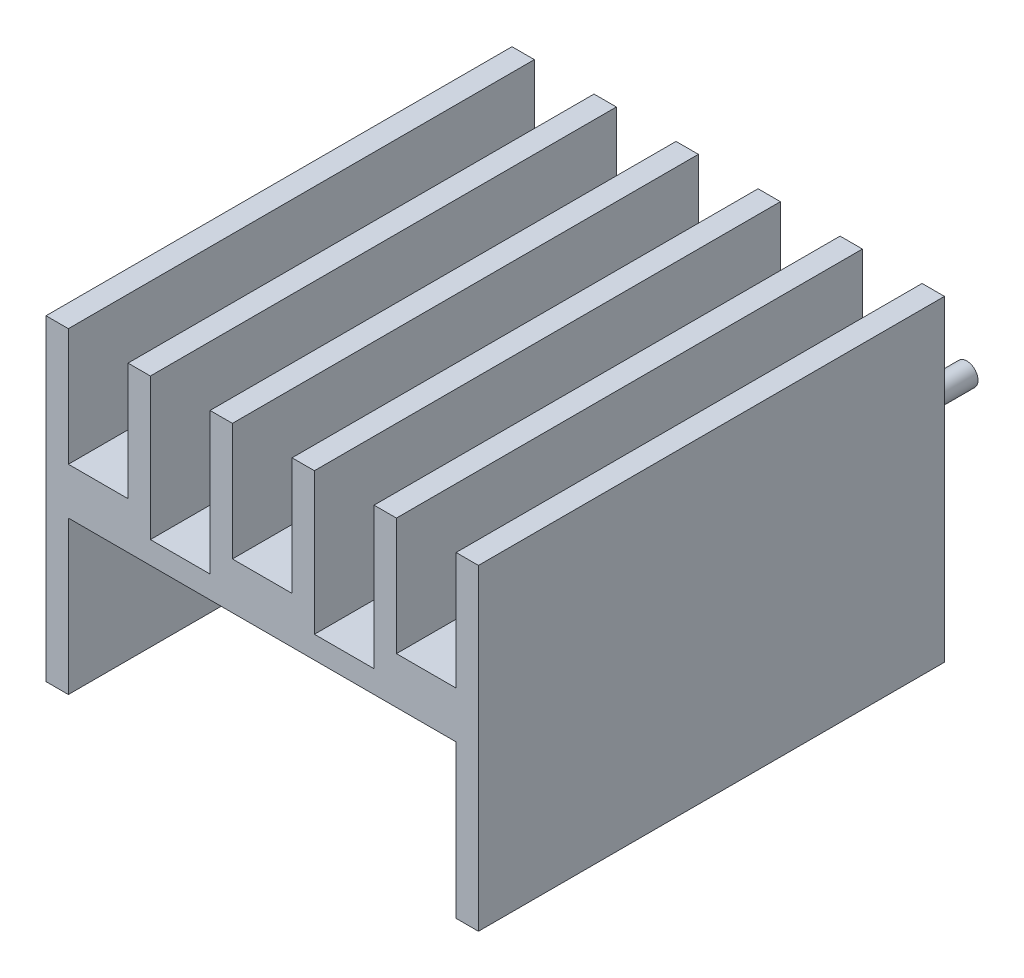
ISO-10303-21;
HEADER;
FILE_DESCRIPTION(('STEP AP214'),'2;1');
FILE_NAME('part.step','',(''),(''),'','','');
FILE_SCHEMA(('AUTOMOTIVE_DESIGN { 1 0 10303 214 1 1 1 1 }'));
ENDSEC;
DATA;
#1=APPLICATION_CONTEXT('core data for automotive mechanical design processes');
#2=APPLICATION_PROTOCOL_DEFINITION('international standard','automotive_design',2000,#1);
#3=PRODUCT_CONTEXT('',#1,'mechanical');
#4=PRODUCT('Part','Part','',(#3));
#5=PRODUCT_RELATED_PRODUCT_CATEGORY('part','',(#4));
#6=PRODUCT_DEFINITION_FORMATION('','',#4);
#7=PRODUCT_DEFINITION_CONTEXT('part definition',#1,'design');
#8=PRODUCT_DEFINITION('design','',#6,#7);
#9=PRODUCT_DEFINITION_SHAPE('','',#8);
#10=(LENGTH_UNIT() NAMED_UNIT(*) SI_UNIT(.MILLI.,.METRE.));
#11=(NAMED_UNIT(*) PLANE_ANGLE_UNIT() SI_UNIT($,.RADIAN.));
#12=(NAMED_UNIT(*) SI_UNIT($,.STERADIAN.) SOLID_ANGLE_UNIT());
#13=UNCERTAINTY_MEASURE_WITH_UNIT(LENGTH_MEASURE(1.E-05),#10,'distance_accuracy_value','');
#14=(GEOMETRIC_REPRESENTATION_CONTEXT(3) GLOBAL_UNCERTAINTY_ASSIGNED_CONTEXT((#13)) GLOBAL_UNIT_ASSIGNED_CONTEXT((#10,
#11,#12)) REPRESENTATION_CONTEXT('',''));
#15=CARTESIAN_POINT('',(0.,0.,0.));
#16=DIRECTION('',(0.,0.,1.));
#17=DIRECTION('',(1.,0.,0.));
#18=AXIS2_PLACEMENT_3D('',#15,#16,#17);
#19=CARTESIAN_POINT('',(0.,0.,0.));
#20=DIRECTION('',(0.,0.,1.));
#21=DIRECTION('',(1.,0.,0.));
#22=AXIS2_PLACEMENT_3D('',#19,#20,#21);
#23=PLANE('',#22);
#24=CARTESIAN_POINT('',(8.8,1.8,0.));
#25=DIRECTION('',(0.,0.,1.));
#26=DIRECTION('',(1.,0.,0.));
#27=AXIS2_PLACEMENT_3D('',#24,#25,#26);
#28=CIRCLE('',#27,0.6);
#29=CARTESIAN_POINT('',(9.4,1.8,0.));
#30=VERTEX_POINT('',#29);
#31=EDGE_CURVE('E44',#30,#30,#28,.F.);
#32=ORIENTED_EDGE('',*,*,#31,.F.);
#33=EDGE_LOOP('',(#32));
#34=FACE_BOUND('',#33,.T.);
#35=DIRECTION('',(-1.,0.,0.));
#36=VECTOR('',#35,1.);
#37=CARTESIAN_POINT('',(-10.4,8.8,0.));
#38=LINE('',#37,#36);
#39=CARTESIAN_POINT('',(-10.4,8.8,0.));
#40=VERTEX_POINT('',#39);
#41=CARTESIAN_POINT('',(-11.6,8.8,0.));
#42=VERTEX_POINT('',#41);
#43=EDGE_CURVE('E253',#40,#42,#38,.T.);
#44=ORIENTED_EDGE('',*,*,#43,.F.);
#45=DIRECTION('',(0.,1.,0.));
#46=VECTOR('',#45,1.);
#47=CARTESIAN_POINT('',(-10.4,2.5,0.));
#48=LINE('',#47,#46);
#49=CARTESIAN_POINT('',(-10.4,2.5,0.));
#50=VERTEX_POINT('',#49);
#51=EDGE_CURVE('E147',#50,#40,#48,.T.);
#52=ORIENTED_EDGE('',*,*,#51,.F.);
#53=DIRECTION('',(-1.,0.,0.));
#54=VECTOR('',#53,1.);
#55=CARTESIAN_POINT('',(-7.19999999999999,2.5,0.));
#56=LINE('',#55,#54);
#57=CARTESIAN_POINT('',(-7.19999999999999,2.5,0.));
#58=VERTEX_POINT('',#57);
#59=EDGE_CURVE('E141',#58,#50,#56,.T.);
#60=ORIENTED_EDGE('',*,*,#59,.F.);
#61=DIRECTION('',(0.,-1.,0.));
#62=VECTOR('',#61,1.);
#63=CARTESIAN_POINT('',(-7.2,8.8,0.));
#64=LINE('',#63,#62);
#65=CARTESIAN_POINT('',(-7.2,8.8,0.));
#66=VERTEX_POINT('',#65);
#67=EDGE_CURVE('E243',#66,#58,#64,.T.);
#68=ORIENTED_EDGE('',*,*,#67,.F.);
#69=DIRECTION('',(-1.,0.,0.));
#70=VECTOR('',#69,1.);
#71=CARTESIAN_POINT('',(-6.,8.8,0.));
#72=LINE('',#71,#70);
#73=CARTESIAN_POINT('',(-6.,8.8,0.));
#74=VERTEX_POINT('',#73);
#75=EDGE_CURVE('E303',#74,#66,#72,.T.);
#76=ORIENTED_EDGE('',*,*,#75,.F.);
#77=DIRECTION('',(0.,1.,0.));
#78=VECTOR('',#77,1.);
#79=CARTESIAN_POINT('',(-6.,1.2,0.));
#80=LINE('',#79,#78);
#81=CARTESIAN_POINT('',(-6.,1.2,0.));
#82=VERTEX_POINT('',#81);
#83=EDGE_CURVE('E301',#82,#74,#80,.T.);
#84=ORIENTED_EDGE('',*,*,#83,.F.);
#85=DIRECTION('',(-1.,0.,0.));
#86=VECTOR('',#85,1.);
#87=CARTESIAN_POINT('',(-2.8,1.2,0.));
#88=LINE('',#87,#86);
#89=CARTESIAN_POINT('',(-2.8,1.2,0.));
#90=VERTEX_POINT('',#89);
#91=EDGE_CURVE('E299',#90,#82,#88,.T.);
#92=ORIENTED_EDGE('',*,*,#91,.F.);
#93=DIRECTION('',(0.,-1.,0.));
#94=VECTOR('',#93,1.);
#95=CARTESIAN_POINT('',(-2.8,8.8,0.));
#96=LINE('',#95,#94);
#97=CARTESIAN_POINT('',(-2.8,8.8,0.));
#98=VERTEX_POINT('',#97);
#99=EDGE_CURVE('E297',#98,#90,#96,.T.);
#100=ORIENTED_EDGE('',*,*,#99,.F.);
#101=DIRECTION('',(-1.,0.,0.));
#102=VECTOR('',#101,1.);
#103=CARTESIAN_POINT('',(-1.6,8.8,0.));
#104=LINE('',#103,#102);
#105=CARTESIAN_POINT('',(-1.6,8.8,0.));
#106=VERTEX_POINT('',#105);
#107=EDGE_CURVE('E295',#106,#98,#104,.T.);
#108=ORIENTED_EDGE('',*,*,#107,.F.);
#109=DIRECTION('',(0.,1.,0.));
#110=VECTOR('',#109,1.);
#111=CARTESIAN_POINT('',(-1.6,2.5,0.));
#112=LINE('',#111,#110);
#113=CARTESIAN_POINT('',(-1.6,2.5,0.));
#114=VERTEX_POINT('',#113);
#115=EDGE_CURVE('E293',#114,#106,#112,.T.);
#116=ORIENTED_EDGE('',*,*,#115,.F.);
#117=DIRECTION('',(-1.,0.,0.));
#118=VECTOR('',#117,1.);
#119=CARTESIAN_POINT('',(1.6,2.5,0.));
#120=LINE('',#119,#118);
#121=CARTESIAN_POINT('',(1.6,2.5,0.));
#122=VERTEX_POINT('',#121);
#123=EDGE_CURVE('E291',#122,#114,#120,.T.);
#124=ORIENTED_EDGE('',*,*,#123,.F.);
#125=DIRECTION('',(0.,-1.,0.));
#126=VECTOR('',#125,1.);
#127=CARTESIAN_POINT('',(1.6,2.5,0.));
#128=LINE('',#127,#126);
#129=CARTESIAN_POINT('',(1.6,8.8,0.));
#130=VERTEX_POINT('',#129);
#131=EDGE_CURVE('E289',#130,#122,#128,.T.);
#132=ORIENTED_EDGE('',*,*,#131,.F.);
#133=DIRECTION('',(-1.,0.,0.));
#134=VECTOR('',#133,1.);
#135=CARTESIAN_POINT('',(1.6,8.8,0.));
#136=LINE('',#135,#134);
#137=CARTESIAN_POINT('',(2.8,8.8,0.));
#138=VERTEX_POINT('',#137);
#139=EDGE_CURVE('E287',#138,#130,#136,.T.);
#140=ORIENTED_EDGE('',*,*,#139,.F.);
#141=DIRECTION('',(0.,1.,0.));
#142=VECTOR('',#141,1.);
#143=CARTESIAN_POINT('',(2.8,8.8,0.));
#144=LINE('',#143,#142);
#145=CARTESIAN_POINT('',(2.8,1.2,0.));
#146=VERTEX_POINT('',#145);
#147=EDGE_CURVE('E285',#146,#138,#144,.T.);
#148=ORIENTED_EDGE('',*,*,#147,.F.);
#149=DIRECTION('',(-1.,0.,0.));
#150=VECTOR('',#149,1.);
#151=CARTESIAN_POINT('',(2.8,1.2,0.));
#152=LINE('',#151,#150);
#153=CARTESIAN_POINT('',(6.,1.2,0.));
#154=VERTEX_POINT('',#153);
#155=EDGE_CURVE('E283',#154,#146,#152,.T.);
#156=ORIENTED_EDGE('',*,*,#155,.F.);
#157=DIRECTION('',(0.,-1.,0.));
#158=VECTOR('',#157,1.);
#159=CARTESIAN_POINT('',(6.,1.2,0.));
#160=LINE('',#159,#158);
#161=CARTESIAN_POINT('',(6.,8.8,0.));
#162=VERTEX_POINT('',#161);
#163=EDGE_CURVE('E281',#162,#154,#160,.T.);
#164=ORIENTED_EDGE('',*,*,#163,.F.);
#165=DIRECTION('',(-1.,0.,0.));
#166=VECTOR('',#165,1.);
#167=CARTESIAN_POINT('',(6.,8.8,0.));
#168=LINE('',#167,#166);
#169=CARTESIAN_POINT('',(7.2,8.8,0.));
#170=VERTEX_POINT('',#169);
#171=EDGE_CURVE('E279',#170,#162,#168,.T.);
#172=ORIENTED_EDGE('',*,*,#171,.F.);
#173=DIRECTION('',(0.,1.,0.));
#174=VECTOR('',#173,1.);
#175=CARTESIAN_POINT('',(7.2,8.8,0.));
#176=LINE('',#175,#174);
#177=CARTESIAN_POINT('',(7.19999999999999,2.5,0.));
#178=VERTEX_POINT('',#177);
#179=EDGE_CURVE('E277',#178,#170,#176,.T.);
#180=ORIENTED_EDGE('',*,*,#179,.F.);
#181=DIRECTION('',(-1.,0.,0.));
#182=VECTOR('',#181,1.);
#183=CARTESIAN_POINT('',(7.19999999999999,2.5,0.));
#184=LINE('',#183,#182);
#185=CARTESIAN_POINT('',(10.4,2.5,0.));
#186=VERTEX_POINT('',#185);
#187=EDGE_CURVE('E275',#186,#178,#184,.T.);
#188=ORIENTED_EDGE('',*,*,#187,.F.);
#189=DIRECTION('',(0.,-1.,0.));
#190=VECTOR('',#189,1.);
#191=CARTESIAN_POINT('',(10.4,2.5,0.));
#192=LINE('',#191,#190);
#193=CARTESIAN_POINT('',(10.4,8.8,0.));
#194=VERTEX_POINT('',#193);
#195=EDGE_CURVE('E273',#194,#186,#192,.T.);
#196=ORIENTED_EDGE('',*,*,#195,.F.);
#197=DIRECTION('',(-1.,0.,0.));
#198=VECTOR('',#197,1.);
#199=CARTESIAN_POINT('',(10.4,8.8,0.));
#200=LINE('',#199,#198);
#201=CARTESIAN_POINT('',(11.6,8.8,0.));
#202=VERTEX_POINT('',#201);
#203=EDGE_CURVE('E271',#202,#194,#200,.T.);
#204=ORIENTED_EDGE('',*,*,#203,.F.);
#205=DIRECTION('',(0.,1.,0.));
#206=VECTOR('',#205,1.);
#207=CARTESIAN_POINT('',(11.6,8.8,0.));
#208=LINE('',#207,#206);
#209=CARTESIAN_POINT('',(11.6,-8.2,0.));
#210=VERTEX_POINT('',#209);
#211=EDGE_CURVE('E269',#210,#202,#208,.T.);
#212=ORIENTED_EDGE('',*,*,#211,.F.);
#213=DIRECTION('',(1.,0.,0.));
#214=VECTOR('',#213,1.);
#215=CARTESIAN_POINT('',(11.6,-8.2,0.));
#216=LINE('',#215,#214);
#217=CARTESIAN_POINT('',(10.4,-8.2,0.));
#218=VERTEX_POINT('',#217);
#219=EDGE_CURVE('E267',#218,#210,#216,.T.);
#220=ORIENTED_EDGE('',*,*,#219,.F.);
#221=DIRECTION('',(0.,-1.,0.));
#222=VECTOR('',#221,1.);
#223=CARTESIAN_POINT('',(10.4,-8.2,0.));
#224=LINE('',#223,#222);
#225=CARTESIAN_POINT('',(10.4,0.,0.));
#226=VERTEX_POINT('',#225);
#227=EDGE_CURVE('E265',#226,#218,#224,.T.);
#228=ORIENTED_EDGE('',*,*,#227,.F.);
#229=DIRECTION('',(1.,0.,0.));
#230=VECTOR('',#229,1.);
#231=CARTESIAN_POINT('',(-10.4,0.,0.));
#232=LINE('',#231,#230);
#233=CARTESIAN_POINT('',(-10.4,0.,0.));
#234=VERTEX_POINT('',#233);
#235=EDGE_CURVE('E263',#234,#226,#232,.T.);
#236=ORIENTED_EDGE('',*,*,#235,.F.);
#237=DIRECTION('',(0.,1.,0.));
#238=VECTOR('',#237,1.);
#239=CARTESIAN_POINT('',(-10.4,-8.2,0.));
#240=LINE('',#239,#238);
#241=CARTESIAN_POINT('',(-10.4,-8.2,0.));
#242=VERTEX_POINT('',#241);
#243=EDGE_CURVE('E261',#242,#234,#240,.T.);
#244=ORIENTED_EDGE('',*,*,#243,.F.);
#245=DIRECTION('',(1.,0.,0.));
#246=VECTOR('',#245,1.);
#247=CARTESIAN_POINT('',(-11.6,-8.2,0.));
#248=LINE('',#247,#246);
#249=CARTESIAN_POINT('',(-11.6,-8.2,0.));
#250=VERTEX_POINT('',#249);
#251=EDGE_CURVE('E259',#250,#242,#248,.T.);
#252=ORIENTED_EDGE('',*,*,#251,.F.);
#253=DIRECTION('',(0.,-1.,0.));
#254=VECTOR('',#253,1.);
#255=CARTESIAN_POINT('',(-11.6,8.8,0.));
#256=LINE('',#255,#254);
#257=EDGE_CURVE('E256',#42,#250,#256,.T.);
#258=ORIENTED_EDGE('',*,*,#257,.F.);
#259=EDGE_LOOP('',(#44,#52,#60,#68,#76,#84,#92,#100,#108,#116,#124,#132,#140,#148,#156,#164,
#172,#180,#188,#196,#204,#212,#220,#228,#236,#244,#252,#258));
#260=FACE_BOUND('',#259,.T.);
#261=CARTESIAN_POINT('',(-8.8,1.8,0.));
#262=DIRECTION('',(0.,0.,1.));
#263=DIRECTION('',(1.,0.,0.));
#264=AXIS2_PLACEMENT_3D('',#261,#262,#263);
#265=CIRCLE('',#264,0.6);
#266=CARTESIAN_POINT('',(-8.2,1.8,0.));
#267=VERTEX_POINT('',#266);
#268=EDGE_CURVE('E11',#267,#267,#265,.F.);
#269=ORIENTED_EDGE('',*,*,#268,.F.);
#270=EDGE_LOOP('',(#269));
#271=FACE_BOUND('',#270,.T.);
#272=ADVANCED_FACE('F35',(#34,#260,#271),#23,.F.);
#273=CARTESIAN_POINT('',(-10.4,8.8,25.));
#274=DIRECTION('',(0.,-1.,0.));
#275=DIRECTION('',(0.,0.,-1.));
#276=AXIS2_PLACEMENT_3D('',#273,#274,#275);
#277=PLANE('',#276);
#278=ORIENTED_EDGE('',*,*,#43,.T.);
#279=DIRECTION('',(0.,0.,-1.));
#280=VECTOR('',#279,1.);
#281=CARTESIAN_POINT('',(-11.6,8.8,25.));
#282=LINE('',#281,#280);
#283=CARTESIAN_POINT('',(-11.6,8.8,25.));
#284=VERTEX_POINT('',#283);
#285=EDGE_CURVE('E381',#284,#42,#282,.T.);
#286=ORIENTED_EDGE('',*,*,#285,.F.);
#287=DIRECTION('',(-1.,0.,0.));
#288=VECTOR('',#287,1.);
#289=CARTESIAN_POINT('',(-10.4,8.8,25.));
#290=LINE('',#289,#288);
#291=CARTESIAN_POINT('',(-10.4,8.8,25.));
#292=VERTEX_POINT('',#291);
#293=EDGE_CURVE('E308',#292,#284,#290,.T.);
#294=ORIENTED_EDGE('',*,*,#293,.F.);
#295=DIRECTION('',(0.,0.,-1.));
#296=VECTOR('',#295,1.);
#297=CARTESIAN_POINT('',(-10.4,8.8,25.));
#298=LINE('',#297,#296);
#299=EDGE_CURVE('E249',#292,#40,#298,.T.);
#300=ORIENTED_EDGE('',*,*,#299,.T.);
#301=EDGE_LOOP('',(#278,#286,#294,#300));
#302=FACE_BOUND('',#301,.T.);
#303=ADVANCED_FACE('F37',(#302),#277,.F.);
#304=CARTESIAN_POINT('',(-11.6,8.8,25.));
#305=DIRECTION('',(1.,0.,0.));
#306=DIRECTION('',(0.,1.,0.));
#307=AXIS2_PLACEMENT_3D('',#304,#305,#306);
#308=PLANE('',#307);
#309=ORIENTED_EDGE('',*,*,#257,.T.);
#310=DIRECTION('',(0.,0.,-1.));
#311=VECTOR('',#310,1.);
#312=CARTESIAN_POINT('',(-11.6,-8.2,25.));
#313=LINE('',#312,#311);
#314=CARTESIAN_POINT('',(-11.6,-8.2,25.));
#315=VERTEX_POINT('',#314);
#316=EDGE_CURVE('E378',#315,#250,#313,.T.);
#317=ORIENTED_EDGE('',*,*,#316,.F.);
#318=DIRECTION('',(0.,-1.,0.));
#319=VECTOR('',#318,1.);
#320=CARTESIAN_POINT('',(-11.6,8.8,25.));
#321=LINE('',#320,#319);
#322=EDGE_CURVE('E156',#284,#315,#321,.T.);
#323=ORIENTED_EDGE('',*,*,#322,.F.);
#324=ORIENTED_EDGE('',*,*,#285,.T.);
#325=EDGE_LOOP('',(#309,#317,#323,#324));
#326=FACE_BOUND('',#325,.T.);
#327=ADVANCED_FACE('F512',(#326),#308,.F.);
#328=CARTESIAN_POINT('',(-11.6,-8.2,25.));
#329=DIRECTION('',(0.,1.,0.));
#330=DIRECTION('',(0.,0.,1.));
#331=AXIS2_PLACEMENT_3D('',#328,#329,#330);
#332=PLANE('',#331);
#333=ORIENTED_EDGE('',*,*,#251,.T.);
#334=DIRECTION('',(0.,0.,-1.));
#335=VECTOR('',#334,1.);
#336=CARTESIAN_POINT('',(-10.4,-8.2,25.));
#337=LINE('',#336,#335);
#338=CARTESIAN_POINT('',(-10.4,-8.2,25.));
#339=VERTEX_POINT('',#338);
#340=EDGE_CURVE('E375',#339,#242,#337,.T.);
#341=ORIENTED_EDGE('',*,*,#340,.F.);
#342=DIRECTION('',(1.,0.,0.));
#343=VECTOR('',#342,1.);
#344=CARTESIAN_POINT('',(-11.6,-8.2,25.));
#345=LINE('',#344,#343);
#346=EDGE_CURVE('E523',#315,#339,#345,.T.);
#347=ORIENTED_EDGE('',*,*,#346,.F.);
#348=ORIENTED_EDGE('',*,*,#316,.T.);
#349=EDGE_LOOP('',(#333,#341,#347,#348));
#350=FACE_BOUND('',#349,.T.);
#351=ADVANCED_FACE('F509',(#350),#332,.F.);
#352=CARTESIAN_POINT('',(-10.4,-8.2,25.));
#353=DIRECTION('',(-1.,0.,0.));
#354=DIRECTION('',(0.,-1.,0.));
#355=AXIS2_PLACEMENT_3D('',#352,#353,#354);
#356=PLANE('',#355);
#357=ORIENTED_EDGE('',*,*,#243,.T.);
#358=DIRECTION('',(0.,0.,-1.));
#359=VECTOR('',#358,1.);
#360=CARTESIAN_POINT('',(-10.4,0.,25.));
#361=LINE('',#360,#359);
#362=CARTESIAN_POINT('',(-10.4,0.,25.));
#363=VERTEX_POINT('',#362);
#364=EDGE_CURVE('E372',#363,#234,#361,.T.);
#365=ORIENTED_EDGE('',*,*,#364,.F.);
#366=DIRECTION('',(0.,1.,0.));
#367=VECTOR('',#366,1.);
#368=CARTESIAN_POINT('',(-10.4,-8.2,25.));
#369=LINE('',#368,#367);
#370=EDGE_CURVE('E534',#339,#363,#369,.T.);
#371=ORIENTED_EDGE('',*,*,#370,.F.);
#372=ORIENTED_EDGE('',*,*,#340,.T.);
#373=EDGE_LOOP('',(#357,#365,#371,#372));
#374=FACE_BOUND('',#373,.T.);
#375=ADVANCED_FACE('F505',(#374),#356,.F.);
#376=CARTESIAN_POINT('',(-10.4,0.,25.));
#377=DIRECTION('',(0.,1.,0.));
#378=DIRECTION('',(0.,0.,1.));
#379=AXIS2_PLACEMENT_3D('',#376,#377,#378);
#380=PLANE('',#379);
#381=ORIENTED_EDGE('',*,*,#235,.T.);
#382=DIRECTION('',(0.,0.,-1.));
#383=VECTOR('',#382,1.);
#384=CARTESIAN_POINT('',(10.4,0.,25.));
#385=LINE('',#384,#383);
#386=CARTESIAN_POINT('',(10.4,0.,25.));
#387=VERTEX_POINT('',#386);
#388=EDGE_CURVE('E369',#387,#226,#385,.T.);
#389=ORIENTED_EDGE('',*,*,#388,.F.);
#390=DIRECTION('',(1.,0.,0.));
#391=VECTOR('',#390,1.);
#392=CARTESIAN_POINT('',(-10.4,0.,25.));
#393=LINE('',#392,#391);
#394=EDGE_CURVE('E531',#363,#387,#393,.T.);
#395=ORIENTED_EDGE('',*,*,#394,.F.);
#396=ORIENTED_EDGE('',*,*,#364,.T.);
#397=EDGE_LOOP('',(#381,#389,#395,#396));
#398=FACE_BOUND('',#397,.T.);
#399=ADVANCED_FACE('F501',(#398),#380,.F.);
#400=CARTESIAN_POINT('',(10.4,-8.2,25.));
#401=DIRECTION('',(1.,0.,0.));
#402=DIRECTION('',(0.,1.,0.));
#403=AXIS2_PLACEMENT_3D('',#400,#401,#402);
#404=PLANE('',#403);
#405=ORIENTED_EDGE('',*,*,#227,.T.);
#406=DIRECTION('',(0.,0.,-1.));
#407=VECTOR('',#406,1.);
#408=CARTESIAN_POINT('',(10.4,-8.2,25.));
#409=LINE('',#408,#407);
#410=CARTESIAN_POINT('',(10.4,-8.2,25.));
#411=VERTEX_POINT('',#410);
#412=EDGE_CURVE('E366',#411,#218,#409,.T.);
#413=ORIENTED_EDGE('',*,*,#412,.F.);
#414=DIRECTION('',(0.,-1.,0.));
#415=VECTOR('',#414,1.);
#416=CARTESIAN_POINT('',(10.4,-8.2,25.));
#417=LINE('',#416,#415);
#418=EDGE_CURVE('E533',#387,#411,#417,.T.);
#419=ORIENTED_EDGE('',*,*,#418,.F.);
#420=ORIENTED_EDGE('',*,*,#388,.T.);
#421=EDGE_LOOP('',(#405,#413,#419,#420));
#422=FACE_BOUND('',#421,.T.);
#423=ADVANCED_FACE('F497',(#422),#404,.F.);
#424=CARTESIAN_POINT('',(11.6,-8.2,25.));
#425=DIRECTION('',(0.,1.,0.));
#426=DIRECTION('',(0.,0.,1.));
#427=AXIS2_PLACEMENT_3D('',#424,#425,#426);
#428=PLANE('',#427);
#429=ORIENTED_EDGE('',*,*,#219,.T.);
#430=DIRECTION('',(0.,0.,-1.));
#431=VECTOR('',#430,1.);
#432=CARTESIAN_POINT('',(11.6,-8.2,25.));
#433=LINE('',#432,#431);
#434=CARTESIAN_POINT('',(11.6,-8.2,25.));
#435=VERTEX_POINT('',#434);
#436=EDGE_CURVE('E363',#435,#210,#433,.T.);
#437=ORIENTED_EDGE('',*,*,#436,.F.);
#438=DIRECTION('',(1.,0.,0.));
#439=VECTOR('',#438,1.);
#440=CARTESIAN_POINT('',(11.6,-8.2,25.));
#441=LINE('',#440,#439);
#442=EDGE_CURVE('E536',#411,#435,#441,.T.);
#443=ORIENTED_EDGE('',*,*,#442,.F.);
#444=ORIENTED_EDGE('',*,*,#412,.T.);
#445=EDGE_LOOP('',(#429,#437,#443,#444));
#446=FACE_BOUND('',#445,.T.);
#447=ADVANCED_FACE('F493',(#446),#428,.F.);
#448=CARTESIAN_POINT('',(11.6,8.8,25.));
#449=DIRECTION('',(-1.,0.,0.));
#450=DIRECTION('',(0.,-1.,0.));
#451=AXIS2_PLACEMENT_3D('',#448,#449,#450);
#452=PLANE('',#451);
#453=ORIENTED_EDGE('',*,*,#211,.T.);
#454=DIRECTION('',(0.,0.,-1.));
#455=VECTOR('',#454,1.);
#456=CARTESIAN_POINT('',(11.6,8.8,25.));
#457=LINE('',#456,#455);
#458=CARTESIAN_POINT('',(11.6,8.8,25.));
#459=VERTEX_POINT('',#458);
#460=EDGE_CURVE('E360',#459,#202,#457,.T.);
#461=ORIENTED_EDGE('',*,*,#460,.F.);
#462=DIRECTION('',(0.,1.,0.));
#463=VECTOR('',#462,1.);
#464=CARTESIAN_POINT('',(11.6,8.8,25.));
#465=LINE('',#464,#463);
#466=EDGE_CURVE('E542',#435,#459,#465,.T.);
#467=ORIENTED_EDGE('',*,*,#466,.F.);
#468=ORIENTED_EDGE('',*,*,#436,.T.);
#469=EDGE_LOOP('',(#453,#461,#467,#468));
#470=FACE_BOUND('',#469,.T.);
#471=ADVANCED_FACE('F489',(#470),#452,.F.);
#472=CARTESIAN_POINT('',(10.4,8.8,25.));
#473=DIRECTION('',(0.,-1.,0.));
#474=DIRECTION('',(0.,0.,-1.));
#475=AXIS2_PLACEMENT_3D('',#472,#473,#474);
#476=PLANE('',#475);
#477=ORIENTED_EDGE('',*,*,#203,.T.);
#478=DIRECTION('',(0.,0.,-1.));
#479=VECTOR('',#478,1.);
#480=CARTESIAN_POINT('',(10.4,8.8,25.));
#481=LINE('',#480,#479);
#482=CARTESIAN_POINT('',(10.4,8.8,25.));
#483=VERTEX_POINT('',#482);
#484=EDGE_CURVE('E357',#483,#194,#481,.T.);
#485=ORIENTED_EDGE('',*,*,#484,.F.);
#486=DIRECTION('',(-1.,0.,0.));
#487=VECTOR('',#486,1.);
#488=CARTESIAN_POINT('',(10.4,8.8,25.));
#489=LINE('',#488,#487);
#490=EDGE_CURVE('E544',#459,#483,#489,.T.);
#491=ORIENTED_EDGE('',*,*,#490,.F.);
#492=ORIENTED_EDGE('',*,*,#460,.T.);
#493=EDGE_LOOP('',(#477,#485,#491,#492));
#494=FACE_BOUND('',#493,.T.);
#495=ADVANCED_FACE('F485',(#494),#476,.F.);
#496=CARTESIAN_POINT('',(10.4,2.5,25.));
#497=DIRECTION('',(1.,0.,0.));
#498=DIRECTION('',(0.,1.,0.));
#499=AXIS2_PLACEMENT_3D('',#496,#497,#498);
#500=PLANE('',#499);
#501=ORIENTED_EDGE('',*,*,#195,.T.);
#502=DIRECTION('',(0.,0.,-1.));
#503=VECTOR('',#502,1.);
#504=CARTESIAN_POINT('',(10.4,2.5,25.));
#505=LINE('',#504,#503);
#506=CARTESIAN_POINT('',(10.4,2.5,25.));
#507=VERTEX_POINT('',#506);
#508=EDGE_CURVE('E354',#507,#186,#505,.T.);
#509=ORIENTED_EDGE('',*,*,#508,.F.);
#510=DIRECTION('',(0.,-1.,0.));
#511=VECTOR('',#510,1.);
#512=CARTESIAN_POINT('',(10.4,2.5,25.));
#513=LINE('',#512,#511);
#514=EDGE_CURVE('E546',#483,#507,#513,.T.);
#515=ORIENTED_EDGE('',*,*,#514,.F.);
#516=ORIENTED_EDGE('',*,*,#484,.T.);
#517=EDGE_LOOP('',(#501,#509,#515,#516));
#518=FACE_BOUND('',#517,.T.);
#519=ADVANCED_FACE('F481',(#518),#500,.F.);
#520=CARTESIAN_POINT('',(7.19999999999999,2.5,25.));
#521=DIRECTION('',(0.,-1.,0.));
#522=DIRECTION('',(1.,0.,0.));
#523=AXIS2_PLACEMENT_3D('',#520,#521,#522);
#524=PLANE('',#523);
#525=ORIENTED_EDGE('',*,*,#187,.T.);
#526=DIRECTION('',(0.,0.,-1.));
#527=VECTOR('',#526,1.);
#528=CARTESIAN_POINT('',(7.19999999999999,2.5,25.));
#529=LINE('',#528,#527);
#530=CARTESIAN_POINT('',(7.19999999999999,2.5,25.));
#531=VERTEX_POINT('',#530);
#532=EDGE_CURVE('E351',#531,#178,#529,.T.);
#533=ORIENTED_EDGE('',*,*,#532,.F.);
#534=DIRECTION('',(-1.,0.,0.));
#535=VECTOR('',#534,1.);
#536=CARTESIAN_POINT('',(7.19999999999999,2.5,25.));
#537=LINE('',#536,#535);
#538=EDGE_CURVE('E548',#507,#531,#537,.T.);
#539=ORIENTED_EDGE('',*,*,#538,.F.);
#540=ORIENTED_EDGE('',*,*,#508,.T.);
#541=EDGE_LOOP('',(#525,#533,#539,#540));
#542=FACE_BOUND('',#541,.T.);
#543=ADVANCED_FACE('F477',(#542),#524,.F.);
#544=CARTESIAN_POINT('',(7.2,8.8,25.));
#545=DIRECTION('',(-1.,0.,0.));
#546=DIRECTION('',(0.,-1.,0.));
#547=AXIS2_PLACEMENT_3D('',#544,#545,#546);
#548=PLANE('',#547);
#549=ORIENTED_EDGE('',*,*,#179,.T.);
#550=DIRECTION('',(0.,0.,-1.));
#551=VECTOR('',#550,1.);
#552=CARTESIAN_POINT('',(7.2,8.8,25.));
#553=LINE('',#552,#551);
#554=CARTESIAN_POINT('',(7.2,8.8,25.));
#555=VERTEX_POINT('',#554);
#556=EDGE_CURVE('E348',#555,#170,#553,.T.);
#557=ORIENTED_EDGE('',*,*,#556,.F.);
#558=DIRECTION('',(0.,1.,0.));
#559=VECTOR('',#558,1.);
#560=CARTESIAN_POINT('',(7.2,8.8,25.));
#561=LINE('',#560,#559);
#562=EDGE_CURVE('E550',#531,#555,#561,.T.);
#563=ORIENTED_EDGE('',*,*,#562,.F.);
#564=ORIENTED_EDGE('',*,*,#532,.T.);
#565=EDGE_LOOP('',(#549,#557,#563,#564));
#566=FACE_BOUND('',#565,.T.);
#567=ADVANCED_FACE('F473',(#566),#548,.F.);
#568=CARTESIAN_POINT('',(6.,8.8,25.));
#569=DIRECTION('',(0.,-1.,0.));
#570=DIRECTION('',(0.,0.,-1.));
#571=AXIS2_PLACEMENT_3D('',#568,#569,#570);
#572=PLANE('',#571);
#573=ORIENTED_EDGE('',*,*,#171,.T.);
#574=DIRECTION('',(0.,0.,-1.));
#575=VECTOR('',#574,1.);
#576=CARTESIAN_POINT('',(6.,8.8,25.));
#577=LINE('',#576,#575);
#578=CARTESIAN_POINT('',(6.,8.8,25.));
#579=VERTEX_POINT('',#578);
#580=EDGE_CURVE('E345',#579,#162,#577,.T.);
#581=ORIENTED_EDGE('',*,*,#580,.F.);
#582=DIRECTION('',(-1.,0.,0.));
#583=VECTOR('',#582,1.);
#584=CARTESIAN_POINT('',(6.,8.8,25.));
#585=LINE('',#584,#583);
#586=EDGE_CURVE('E552',#555,#579,#585,.T.);
#587=ORIENTED_EDGE('',*,*,#586,.F.);
#588=ORIENTED_EDGE('',*,*,#556,.T.);
#589=EDGE_LOOP('',(#573,#581,#587,#588));
#590=FACE_BOUND('',#589,.T.);
#591=ADVANCED_FACE('F469',(#590),#572,.F.);
#592=CARTESIAN_POINT('',(6.,1.2,25.));
#593=DIRECTION('',(1.,0.,0.));
#594=DIRECTION('',(0.,0.,-1.));
#595=AXIS2_PLACEMENT_3D('',#592,#593,#594);
#596=PLANE('',#595);
#597=ORIENTED_EDGE('',*,*,#163,.T.);
#598=DIRECTION('',(0.,0.,-1.));
#599=VECTOR('',#598,1.);
#600=CARTESIAN_POINT('',(6.,1.2,25.));
#601=LINE('',#600,#599);
#602=CARTESIAN_POINT('',(6.,1.2,25.));
#603=VERTEX_POINT('',#602);
#604=EDGE_CURVE('E342',#603,#154,#601,.T.);
#605=ORIENTED_EDGE('',*,*,#604,.F.);
#606=DIRECTION('',(0.,-1.,0.));
#607=VECTOR('',#606,1.);
#608=CARTESIAN_POINT('',(6.,1.2,25.));
#609=LINE('',#608,#607);
#610=EDGE_CURVE('E554',#579,#603,#609,.T.);
#611=ORIENTED_EDGE('',*,*,#610,.F.);
#612=ORIENTED_EDGE('',*,*,#580,.T.);
#613=EDGE_LOOP('',(#597,#605,#611,#612));
#614=FACE_BOUND('',#613,.T.);
#615=ADVANCED_FACE('F465',(#614),#596,.F.);
#616=CARTESIAN_POINT('',(2.8,1.2,25.));
#617=DIRECTION('',(0.,-1.,0.));
#618=DIRECTION('',(1.,0.,0.));
#619=AXIS2_PLACEMENT_3D('',#616,#617,#618);
#620=PLANE('',#619);
#621=ORIENTED_EDGE('',*,*,#155,.T.);
#622=DIRECTION('',(0.,0.,-1.));
#623=VECTOR('',#622,1.);
#624=CARTESIAN_POINT('',(2.8,1.2,25.));
#625=LINE('',#624,#623);
#626=CARTESIAN_POINT('',(2.8,1.2,25.));
#627=VERTEX_POINT('',#626);
#628=EDGE_CURVE('E339',#627,#146,#625,.T.);
#629=ORIENTED_EDGE('',*,*,#628,.F.);
#630=DIRECTION('',(-1.,0.,0.));
#631=VECTOR('',#630,1.);
#632=CARTESIAN_POINT('',(2.8,1.2,25.));
#633=LINE('',#632,#631);
#634=EDGE_CURVE('E556',#603,#627,#633,.T.);
#635=ORIENTED_EDGE('',*,*,#634,.F.);
#636=ORIENTED_EDGE('',*,*,#604,.T.);
#637=EDGE_LOOP('',(#621,#629,#635,#636));
#638=FACE_BOUND('',#637,.T.);
#639=ADVANCED_FACE('F461',(#638),#620,.F.);
#640=CARTESIAN_POINT('',(2.8,8.8,25.));
#641=DIRECTION('',(-1.,0.,0.));
#642=DIRECTION('',(0.,-1.,0.));
#643=AXIS2_PLACEMENT_3D('',#640,#641,#642);
#644=PLANE('',#643);
#645=ORIENTED_EDGE('',*,*,#147,.T.);
#646=DIRECTION('',(0.,0.,-1.));
#647=VECTOR('',#646,1.);
#648=CARTESIAN_POINT('',(2.8,8.8,25.));
#649=LINE('',#648,#647);
#650=CARTESIAN_POINT('',(2.8,8.8,25.));
#651=VERTEX_POINT('',#650);
#652=EDGE_CURVE('E336',#651,#138,#649,.T.);
#653=ORIENTED_EDGE('',*,*,#652,.F.);
#654=DIRECTION('',(0.,1.,0.));
#655=VECTOR('',#654,1.);
#656=CARTESIAN_POINT('',(2.8,8.8,25.));
#657=LINE('',#656,#655);
#658=EDGE_CURVE('E558',#627,#651,#657,.T.);
#659=ORIENTED_EDGE('',*,*,#658,.F.);
#660=ORIENTED_EDGE('',*,*,#628,.T.);
#661=EDGE_LOOP('',(#645,#653,#659,#660));
#662=FACE_BOUND('',#661,.T.);
#663=ADVANCED_FACE('F457',(#662),#644,.F.);
#664=CARTESIAN_POINT('',(1.6,8.8,25.));
#665=DIRECTION('',(0.,-1.,0.));
#666=DIRECTION('',(0.,0.,-1.));
#667=AXIS2_PLACEMENT_3D('',#664,#665,#666);
#668=PLANE('',#667);
#669=ORIENTED_EDGE('',*,*,#139,.T.);
#670=DIRECTION('',(0.,0.,-1.));
#671=VECTOR('',#670,1.);
#672=CARTESIAN_POINT('',(1.6,8.8,25.));
#673=LINE('',#672,#671);
#674=CARTESIAN_POINT('',(1.6,8.8,25.));
#675=VERTEX_POINT('',#674);
#676=EDGE_CURVE('E333',#675,#130,#673,.T.);
#677=ORIENTED_EDGE('',*,*,#676,.F.);
#678=DIRECTION('',(-1.,0.,0.));
#679=VECTOR('',#678,1.);
#680=CARTESIAN_POINT('',(1.6,8.8,25.));
#681=LINE('',#680,#679);
#682=EDGE_CURVE('E560',#651,#675,#681,.T.);
#683=ORIENTED_EDGE('',*,*,#682,.F.);
#684=ORIENTED_EDGE('',*,*,#652,.T.);
#685=EDGE_LOOP('',(#669,#677,#683,#684));
#686=FACE_BOUND('',#685,.T.);
#687=ADVANCED_FACE('F453',(#686),#668,.F.);
#688=CARTESIAN_POINT('',(1.6,2.5,25.));
#689=DIRECTION('',(1.,0.,0.));
#690=DIRECTION('',(0.,0.,-1.));
#691=AXIS2_PLACEMENT_3D('',#688,#689,#690);
#692=PLANE('',#691);
#693=ORIENTED_EDGE('',*,*,#131,.T.);
#694=DIRECTION('',(0.,0.,-1.));
#695=VECTOR('',#694,1.);
#696=CARTESIAN_POINT('',(1.6,2.5,25.));
#697=LINE('',#696,#695);
#698=CARTESIAN_POINT('',(1.6,2.5,25.));
#699=VERTEX_POINT('',#698);
#700=EDGE_CURVE('E330',#699,#122,#697,.T.);
#701=ORIENTED_EDGE('',*,*,#700,.F.);
#702=DIRECTION('',(0.,-1.,0.));
#703=VECTOR('',#702,1.);
#704=CARTESIAN_POINT('',(1.6,2.5,25.));
#705=LINE('',#704,#703);
#706=EDGE_CURVE('E562',#675,#699,#705,.T.);
#707=ORIENTED_EDGE('',*,*,#706,.F.);
#708=ORIENTED_EDGE('',*,*,#676,.T.);
#709=EDGE_LOOP('',(#693,#701,#707,#708));
#710=FACE_BOUND('',#709,.T.);
#711=ADVANCED_FACE('F449',(#710),#692,.F.);
#712=CARTESIAN_POINT('',(1.6,2.5,25.));
#713=DIRECTION('',(0.,-1.,0.));
#714=DIRECTION('',(0.,0.,-1.));
#715=AXIS2_PLACEMENT_3D('',#712,#713,#714);
#716=PLANE('',#715);
#717=ORIENTED_EDGE('',*,*,#123,.T.);
#718=DIRECTION('',(0.,0.,-1.));
#719=VECTOR('',#718,1.);
#720=CARTESIAN_POINT('',(-1.6,2.5,25.));
#721=LINE('',#720,#719);
#722=CARTESIAN_POINT('',(-1.6,2.5,25.));
#723=VERTEX_POINT('',#722);
#724=EDGE_CURVE('E327',#723,#114,#721,.T.);
#725=ORIENTED_EDGE('',*,*,#724,.F.);
#726=DIRECTION('',(-1.,0.,0.));
#727=VECTOR('',#726,1.);
#728=CARTESIAN_POINT('',(1.6,2.5,25.));
#729=LINE('',#728,#727);
#730=EDGE_CURVE('E564',#699,#723,#729,.T.);
#731=ORIENTED_EDGE('',*,*,#730,.F.);
#732=ORIENTED_EDGE('',*,*,#700,.T.);
#733=EDGE_LOOP('',(#717,#725,#731,#732));
#734=FACE_BOUND('',#733,.T.);
#735=ADVANCED_FACE('F445',(#734),#716,.F.);
#736=CARTESIAN_POINT('',(-1.6,2.5,25.));
#737=DIRECTION('',(-1.,0.,0.));
#738=DIRECTION('',(0.,0.,1.));
#739=AXIS2_PLACEMENT_3D('',#736,#737,#738);
#740=PLANE('',#739);
#741=ORIENTED_EDGE('',*,*,#115,.T.);
#742=DIRECTION('',(0.,0.,-1.));
#743=VECTOR('',#742,1.);
#744=CARTESIAN_POINT('',(-1.6,8.8,25.));
#745=LINE('',#744,#743);
#746=CARTESIAN_POINT('',(-1.6,8.8,25.));
#747=VERTEX_POINT('',#746);
#748=EDGE_CURVE('E324',#747,#106,#745,.T.);
#749=ORIENTED_EDGE('',*,*,#748,.F.);
#750=DIRECTION('',(0.,1.,0.));
#751=VECTOR('',#750,1.);
#752=CARTESIAN_POINT('',(-1.6,2.5,25.));
#753=LINE('',#752,#751);
#754=EDGE_CURVE('E566',#723,#747,#753,.T.);
#755=ORIENTED_EDGE('',*,*,#754,.F.);
#756=ORIENTED_EDGE('',*,*,#724,.T.);
#757=EDGE_LOOP('',(#741,#749,#755,#756));
#758=FACE_BOUND('',#757,.T.);
#759=ADVANCED_FACE('F441',(#758),#740,.F.);
#760=CARTESIAN_POINT('',(-1.6,8.8,25.));
#761=DIRECTION('',(0.,-1.,0.));
#762=DIRECTION('',(0.,0.,-1.));
#763=AXIS2_PLACEMENT_3D('',#760,#761,#762);
#764=PLANE('',#763);
#765=ORIENTED_EDGE('',*,*,#107,.T.);
#766=DIRECTION('',(0.,0.,-1.));
#767=VECTOR('',#766,1.);
#768=CARTESIAN_POINT('',(-2.8,8.8,25.));
#769=LINE('',#768,#767);
#770=CARTESIAN_POINT('',(-2.8,8.8,25.));
#771=VERTEX_POINT('',#770);
#772=EDGE_CURVE('E321',#771,#98,#769,.T.);
#773=ORIENTED_EDGE('',*,*,#772,.F.);
#774=DIRECTION('',(-1.,0.,0.));
#775=VECTOR('',#774,1.);
#776=CARTESIAN_POINT('',(-1.6,8.8,25.));
#777=LINE('',#776,#775);
#778=EDGE_CURVE('E568',#747,#771,#777,.T.);
#779=ORIENTED_EDGE('',*,*,#778,.F.);
#780=ORIENTED_EDGE('',*,*,#748,.T.);
#781=EDGE_LOOP('',(#765,#773,#779,#780));
#782=FACE_BOUND('',#781,.T.);
#783=ADVANCED_FACE('F437',(#782),#764,.F.);
#784=CARTESIAN_POINT('',(-2.8,8.8,25.));
#785=DIRECTION('',(1.,0.,0.));
#786=DIRECTION('',(0.,1.,0.));
#787=AXIS2_PLACEMENT_3D('',#784,#785,#786);
#788=PLANE('',#787);
#789=ORIENTED_EDGE('',*,*,#99,.T.);
#790=DIRECTION('',(0.,0.,-1.));
#791=VECTOR('',#790,1.);
#792=CARTESIAN_POINT('',(-2.8,1.2,25.));
#793=LINE('',#792,#791);
#794=CARTESIAN_POINT('',(-2.8,1.2,25.));
#795=VERTEX_POINT('',#794);
#796=EDGE_CURVE('E318',#795,#90,#793,.T.);
#797=ORIENTED_EDGE('',*,*,#796,.F.);
#798=DIRECTION('',(0.,-1.,0.));
#799=VECTOR('',#798,1.);
#800=CARTESIAN_POINT('',(-2.8,8.8,25.));
#801=LINE('',#800,#799);
#802=EDGE_CURVE('E570',#771,#795,#801,.T.);
#803=ORIENTED_EDGE('',*,*,#802,.F.);
#804=ORIENTED_EDGE('',*,*,#772,.T.);
#805=EDGE_LOOP('',(#789,#797,#803,#804));
#806=FACE_BOUND('',#805,.T.);
#807=ADVANCED_FACE('F433',(#806),#788,.F.);
#808=CARTESIAN_POINT('',(-2.8,1.2,25.));
#809=DIRECTION('',(0.,-1.,0.));
#810=DIRECTION('',(1.,0.,0.));
#811=AXIS2_PLACEMENT_3D('',#808,#809,#810);
#812=PLANE('',#811);
#813=ORIENTED_EDGE('',*,*,#91,.T.);
#814=DIRECTION('',(0.,0.,-1.));
#815=VECTOR('',#814,1.);
#816=CARTESIAN_POINT('',(-6.,1.2,25.));
#817=LINE('',#816,#815);
#818=CARTESIAN_POINT('',(-6.,1.2,25.));
#819=VERTEX_POINT('',#818);
#820=EDGE_CURVE('E315',#819,#82,#817,.T.);
#821=ORIENTED_EDGE('',*,*,#820,.F.);
#822=DIRECTION('',(-1.,0.,0.));
#823=VECTOR('',#822,1.);
#824=CARTESIAN_POINT('',(-2.8,1.2,25.));
#825=LINE('',#824,#823);
#826=EDGE_CURVE('E572',#795,#819,#825,.T.);
#827=ORIENTED_EDGE('',*,*,#826,.F.);
#828=ORIENTED_EDGE('',*,*,#796,.T.);
#829=EDGE_LOOP('',(#813,#821,#827,#828));
#830=FACE_BOUND('',#829,.T.);
#831=ADVANCED_FACE('F429',(#830),#812,.F.);
#832=CARTESIAN_POINT('',(-6.,1.2,25.));
#833=DIRECTION('',(-1.,0.,0.));
#834=DIRECTION('',(0.,0.,1.));
#835=AXIS2_PLACEMENT_3D('',#832,#833,#834);
#836=PLANE('',#835);
#837=ORIENTED_EDGE('',*,*,#83,.T.);
#838=DIRECTION('',(0.,0.,-1.));
#839=VECTOR('',#838,1.);
#840=CARTESIAN_POINT('',(-6.,8.8,25.));
#841=LINE('',#840,#839);
#842=CARTESIAN_POINT('',(-6.,8.8,25.));
#843=VERTEX_POINT('',#842);
#844=EDGE_CURVE('E312',#843,#74,#841,.T.);
#845=ORIENTED_EDGE('',*,*,#844,.F.);
#846=DIRECTION('',(0.,1.,0.));
#847=VECTOR('',#846,1.);
#848=CARTESIAN_POINT('',(-6.,1.2,25.));
#849=LINE('',#848,#847);
#850=EDGE_CURVE('E574',#819,#843,#849,.T.);
#851=ORIENTED_EDGE('',*,*,#850,.F.);
#852=ORIENTED_EDGE('',*,*,#820,.T.);
#853=EDGE_LOOP('',(#837,#845,#851,#852));
#854=FACE_BOUND('',#853,.T.);
#855=ADVANCED_FACE('F425',(#854),#836,.F.);
#856=CARTESIAN_POINT('',(-6.,8.8,25.));
#857=DIRECTION('',(0.,-1.,0.));
#858=DIRECTION('',(0.,0.,-1.));
#859=AXIS2_PLACEMENT_3D('',#856,#857,#858);
#860=PLANE('',#859);
#861=ORIENTED_EDGE('',*,*,#75,.T.);
#862=DIRECTION('',(0.,0.,-1.));
#863=VECTOR('',#862,1.);
#864=CARTESIAN_POINT('',(-7.2,8.8,25.));
#865=LINE('',#864,#863);
#866=CARTESIAN_POINT('',(-7.2,8.8,25.));
#867=VERTEX_POINT('',#866);
#868=EDGE_CURVE('E244',#867,#66,#865,.T.);
#869=ORIENTED_EDGE('',*,*,#868,.F.);
#870=DIRECTION('',(-1.,0.,0.));
#871=VECTOR('',#870,1.);
#872=CARTESIAN_POINT('',(-6.,8.8,25.));
#873=LINE('',#872,#871);
#874=EDGE_CURVE('E235',#843,#867,#873,.T.);
#875=ORIENTED_EDGE('',*,*,#874,.F.);
#876=ORIENTED_EDGE('',*,*,#844,.T.);
#877=EDGE_LOOP('',(#861,#869,#875,#876));
#878=FACE_BOUND('',#877,.T.);
#879=ADVANCED_FACE('F422',(#878),#860,.F.);
#880=CARTESIAN_POINT('',(-7.2,8.8,25.));
#881=DIRECTION('',(1.,0.,0.));
#882=DIRECTION('',(0.,1.,0.));
#883=AXIS2_PLACEMENT_3D('',#880,#881,#882);
#884=PLANE('',#883);
#885=ORIENTED_EDGE('',*,*,#67,.T.);
#886=DIRECTION('',(0.,0.,-1.));
#887=VECTOR('',#886,1.);
#888=CARTESIAN_POINT('',(-7.19999999999999,2.5,25.));
#889=LINE('',#888,#887);
#890=CARTESIAN_POINT('',(-7.19999999999999,2.5,25.));
#891=VERTEX_POINT('',#890);
#892=EDGE_CURVE('E240',#891,#58,#889,.T.);
#893=ORIENTED_EDGE('',*,*,#892,.F.);
#894=DIRECTION('',(0.,-1.,0.));
#895=VECTOR('',#894,1.);
#896=CARTESIAN_POINT('',(-7.2,8.8,25.));
#897=LINE('',#896,#895);
#898=EDGE_CURVE('E229',#867,#891,#897,.T.);
#899=ORIENTED_EDGE('',*,*,#898,.F.);
#900=ORIENTED_EDGE('',*,*,#868,.T.);
#901=EDGE_LOOP('',(#885,#893,#899,#900));
#902=FACE_BOUND('',#901,.T.);
#903=ADVANCED_FACE('F241',(#902),#884,.F.);
#904=CARTESIAN_POINT('',(-7.19999999999999,2.5,25.));
#905=DIRECTION('',(0.,-1.,0.));
#906=DIRECTION('',(1.,0.,0.));
#907=AXIS2_PLACEMENT_3D('',#904,#905,#906);
#908=PLANE('',#907);
#909=ORIENTED_EDGE('',*,*,#59,.T.);
#910=DIRECTION('',(0.,0.,-1.));
#911=VECTOR('',#910,1.);
#912=CARTESIAN_POINT('',(-10.4,2.5,25.));
#913=LINE('',#912,#911);
#914=CARTESIAN_POINT('',(-10.4,2.5,25.));
#915=VERTEX_POINT('',#914);
#916=EDGE_CURVE('E245',#915,#50,#913,.T.);
#917=ORIENTED_EDGE('',*,*,#916,.F.);
#918=DIRECTION('',(-1.,0.,0.));
#919=VECTOR('',#918,1.);
#920=CARTESIAN_POINT('',(-7.19999999999999,2.5,25.));
#921=LINE('',#920,#919);
#922=EDGE_CURVE('E233',#891,#915,#921,.T.);
#923=ORIENTED_EDGE('',*,*,#922,.F.);
#924=ORIENTED_EDGE('',*,*,#892,.T.);
#925=EDGE_LOOP('',(#909,#917,#923,#924));
#926=FACE_BOUND('',#925,.T.);
#927=ADVANCED_FACE('F247',(#926),#908,.F.);
#928=CARTESIAN_POINT('',(-10.4,2.5,25.));
#929=DIRECTION('',(-1.,0.,0.));
#930=DIRECTION('',(0.,-1.,0.));
#931=AXIS2_PLACEMENT_3D('',#928,#929,#930);
#932=PLANE('',#931);
#933=ORIENTED_EDGE('',*,*,#51,.T.);
#934=ORIENTED_EDGE('',*,*,#299,.F.);
#935=DIRECTION('',(0.,1.,0.));
#936=VECTOR('',#935,1.);
#937=CARTESIAN_POINT('',(-10.4,2.5,25.));
#938=LINE('',#937,#936);
#939=EDGE_CURVE('E52',#915,#292,#938,.T.);
#940=ORIENTED_EDGE('',*,*,#939,.F.);
#941=ORIENTED_EDGE('',*,*,#916,.T.);
#942=EDGE_LOOP('',(#933,#934,#940,#941));
#943=FACE_BOUND('',#942,.T.);
#944=ADVANCED_FACE('F414',(#943),#932,.F.);
#945=CARTESIAN_POINT('',(0.,0.,25.));
#946=DIRECTION('',(0.,0.,1.));
#947=DIRECTION('',(1.,0.,0.));
#948=AXIS2_PLACEMENT_3D('',#945,#946,#947);
#949=PLANE('',#948);
#950=ORIENTED_EDGE('',*,*,#293,.T.);
#951=ORIENTED_EDGE('',*,*,#322,.T.);
#952=ORIENTED_EDGE('',*,*,#346,.T.);
#953=ORIENTED_EDGE('',*,*,#370,.T.);
#954=ORIENTED_EDGE('',*,*,#394,.T.);
#955=ORIENTED_EDGE('',*,*,#418,.T.);
#956=ORIENTED_EDGE('',*,*,#442,.T.);
#957=ORIENTED_EDGE('',*,*,#466,.T.);
#958=ORIENTED_EDGE('',*,*,#490,.T.);
#959=ORIENTED_EDGE('',*,*,#514,.T.);
#960=ORIENTED_EDGE('',*,*,#538,.T.);
#961=ORIENTED_EDGE('',*,*,#562,.T.);
#962=ORIENTED_EDGE('',*,*,#586,.T.);
#963=ORIENTED_EDGE('',*,*,#610,.T.);
#964=ORIENTED_EDGE('',*,*,#634,.T.);
#965=ORIENTED_EDGE('',*,*,#658,.T.);
#966=ORIENTED_EDGE('',*,*,#682,.T.);
#967=ORIENTED_EDGE('',*,*,#706,.T.);
#968=ORIENTED_EDGE('',*,*,#730,.T.);
#969=ORIENTED_EDGE('',*,*,#754,.T.);
#970=ORIENTED_EDGE('',*,*,#778,.T.);
#971=ORIENTED_EDGE('',*,*,#802,.T.);
#972=ORIENTED_EDGE('',*,*,#826,.T.);
#973=ORIENTED_EDGE('',*,*,#850,.T.);
#974=ORIENTED_EDGE('',*,*,#874,.T.);
#975=ORIENTED_EDGE('',*,*,#898,.T.);
#976=ORIENTED_EDGE('',*,*,#922,.T.);
#977=ORIENTED_EDGE('',*,*,#939,.T.);
#978=EDGE_LOOP('',(#950,#951,#952,#953,#954,#955,#956,#957,#958,#959,#960,#961,#962,#963,#964,
#965,#966,#967,#968,#969,#970,#971,#972,#973,#974,#975,#976,#977));
#979=FACE_BOUND('',#978,.T.);
#980=ADVANCED_FACE('F231',(#979),#949,.T.);
#981=CARTESIAN_POINT('',(8.8,1.8,-4.));
#982=DIRECTION('',(0.,0.,1.));
#983=DIRECTION('',(1.,0.,0.));
#984=AXIS2_PLACEMENT_3D('',#981,#982,#983);
#985=CYLINDRICAL_SURFACE('',#984,0.6);
#986=CARTESIAN_POINT('',(8.8,1.8,-4.));
#987=DIRECTION('',(0.,0.,-1.));
#988=DIRECTION('',(-1.,0.,0.));
#989=AXIS2_PLACEMENT_3D('',#986,#987,#988);
#990=CIRCLE('',#989,0.6);
#991=CARTESIAN_POINT('',(8.2,1.8,-4.));
#992=VERTEX_POINT('',#991);
#993=EDGE_CURVE('E257',#992,#992,#990,.T.);
#994=ORIENTED_EDGE('',*,*,#993,.F.);
#995=EDGE_LOOP('',(#994));
#996=FACE_BOUND('',#995,.T.);
#997=ORIENTED_EDGE('',*,*,#31,.T.);
#998=EDGE_LOOP('',(#997));
#999=FACE_BOUND('',#998,.T.);
#1000=ADVANCED_FACE('F385',(#996,#999),#985,.T.);
#1001=CARTESIAN_POINT('',(8.8,1.8,-4.));
#1002=DIRECTION('',(0.,0.,-1.));
#1003=DIRECTION('',(-1.,0.,0.));
#1004=AXIS2_PLACEMENT_3D('',#1001,#1002,#1003);
#1005=PLANE('',#1004);
#1006=ORIENTED_EDGE('',*,*,#993,.T.);
#1007=EDGE_LOOP('',(#1006));
#1008=FACE_BOUND('',#1007,.T.);
#1009=ADVANCED_FACE('F397',(#1008),#1005,.T.);
#1010=CARTESIAN_POINT('',(-8.8,1.8,-4.));
#1011=DIRECTION('',(0.,0.,1.));
#1012=DIRECTION('',(1.,0.,0.));
#1013=AXIS2_PLACEMENT_3D('',#1010,#1011,#1012);
#1014=CYLINDRICAL_SURFACE('',#1013,0.6);
#1015=CARTESIAN_POINT('',(-8.8,1.8,-4.));
#1016=DIRECTION('',(0.,0.,-1.));
#1017=DIRECTION('',(1.,0.,0.));
#1018=AXIS2_PLACEMENT_3D('',#1015,#1016,#1017);
#1019=CIRCLE('',#1018,0.6);
#1020=CARTESIAN_POINT('',(-8.2,1.8,-4.));
#1021=VERTEX_POINT('',#1020);
#1022=EDGE_CURVE('E636',#1021,#1021,#1019,.T.);
#1023=ORIENTED_EDGE('',*,*,#1022,.F.);
#1024=EDGE_LOOP('',(#1023));
#1025=FACE_BOUND('',#1024,.T.);
#1026=ORIENTED_EDGE('',*,*,#268,.T.);
#1027=EDGE_LOOP('',(#1026));
#1028=FACE_BOUND('',#1027,.T.);
#1029=ADVANCED_FACE('F394',(#1025,#1028),#1014,.T.);
#1030=CARTESIAN_POINT('',(-8.8,1.8,-4.));
#1031=DIRECTION('',(0.,0.,1.));
#1032=DIRECTION('',(1.,0.,0.));
#1033=AXIS2_PLACEMENT_3D('',#1030,#1031,#1032);
#1034=PLANE('',#1033);
#1035=ORIENTED_EDGE('',*,*,#1022,.T.);
#1036=EDGE_LOOP('',(#1035));
#1037=FACE_BOUND('',#1036,.T.);
#1038=ADVANCED_FACE('F396',(#1037),#1034,.F.);
#1039=CLOSED_SHELL('',(#272,#303,#327,#351,#375,#399,#423,#447,#471,#495,#519,#543,#567,#591,
#615,#639,#663,#687,#711,#735,#759,#783,#807,#831,#855,#879,#903,#927,#944,#980,#1000,#1009,
#1029,#1038));
#1040=MANIFOLD_SOLID_BREP('B2',#1039);
#1041=ADVANCED_BREP_SHAPE_REPRESENTATION('',(#18,#1040),#14);
#1042=SHAPE_DEFINITION_REPRESENTATION(#9,#1041);
ENDSEC;
END-ISO-10303-21;
